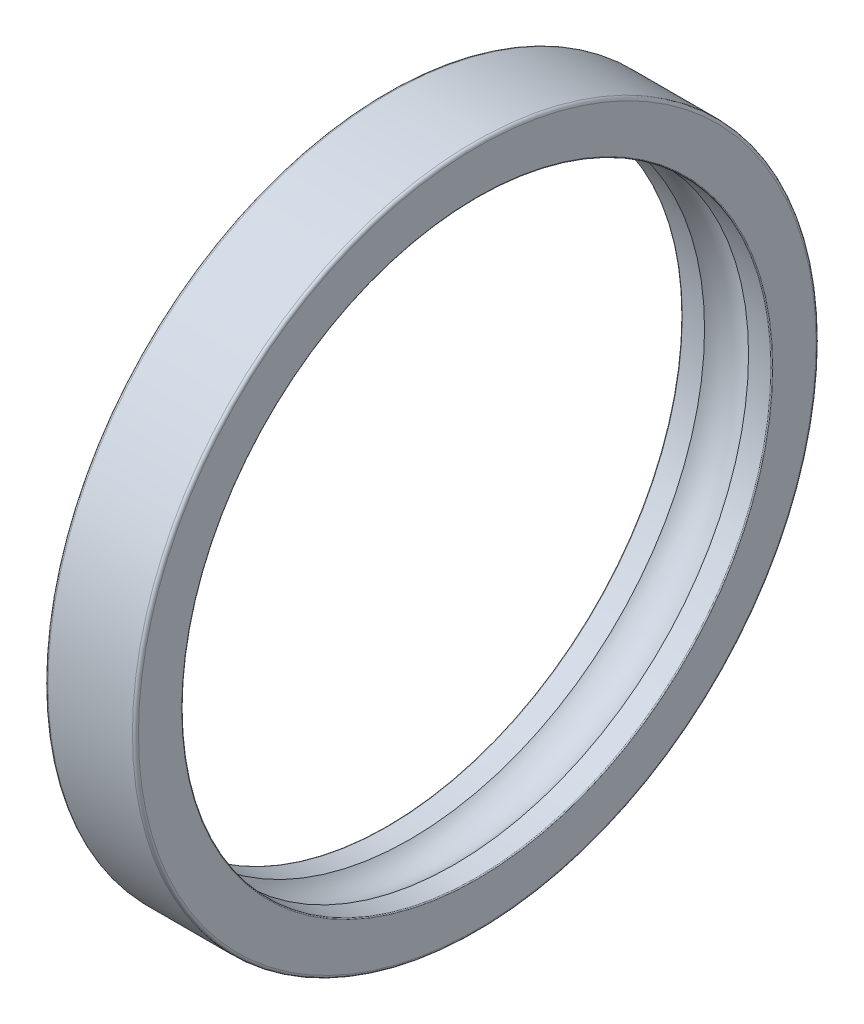
ISO-10303-21;
HEADER;
FILE_DESCRIPTION(('STEP AP214'),'2;1');
FILE_NAME('part.step','',(''),(''),'','','');
FILE_SCHEMA(('AUTOMOTIVE_DESIGN { 1 0 10303 214 1 1 1 1 }'));
ENDSEC;
DATA;
#1=APPLICATION_CONTEXT('core data for automotive mechanical design processes');
#2=APPLICATION_PROTOCOL_DEFINITION('international standard','automotive_design',2000,#1);
#3=PRODUCT_CONTEXT('',#1,'mechanical');
#4=PRODUCT('Part','Part','',(#3));
#5=PRODUCT_RELATED_PRODUCT_CATEGORY('part','',(#4));
#6=PRODUCT_DEFINITION_FORMATION('','',#4);
#7=PRODUCT_DEFINITION_CONTEXT('part definition',#1,'design');
#8=PRODUCT_DEFINITION('design','',#6,#7);
#9=PRODUCT_DEFINITION_SHAPE('','',#8);
#10=(LENGTH_UNIT() NAMED_UNIT(*) SI_UNIT(.MILLI.,.METRE.));
#11=(NAMED_UNIT(*) PLANE_ANGLE_UNIT() SI_UNIT($,.RADIAN.));
#12=(NAMED_UNIT(*) SI_UNIT($,.STERADIAN.) SOLID_ANGLE_UNIT());
#13=UNCERTAINTY_MEASURE_WITH_UNIT(LENGTH_MEASURE(1.E-05),#10,'distance_accuracy_value','');
#14=(GEOMETRIC_REPRESENTATION_CONTEXT(3) GLOBAL_UNCERTAINTY_ASSIGNED_CONTEXT((#13)) GLOBAL_UNIT_ASSIGNED_CONTEXT((#10,
#11,#12)) REPRESENTATION_CONTEXT('',''));
#15=CARTESIAN_POINT('',(0.,0.,0.));
#16=DIRECTION('',(0.,0.,1.));
#17=DIRECTION('',(1.,0.,0.));
#18=AXIS2_PLACEMENT_3D('',#15,#16,#17);
#19=CARTESIAN_POINT('',(0.,-34.0734108237942,-33.7));
#20=DIRECTION('',(-1.,0.,0.));
#21=DIRECTION('',(0.,0.,1.));
#22=AXIS2_PLACEMENT_3D('',#19,#20,#21);
#23=PLANE('',#22);
#24=CARTESIAN_POINT('',(0.,0.,0.));
#25=DIRECTION('',(-1.,0.,0.));
#26=DIRECTION('',(0.,0.,-1.));
#27=AXIS2_PLACEMENT_3D('',#24,#25,#26);
#28=CIRCLE('',#27,33.7);
#29=CARTESIAN_POINT('',(0.,0.,-33.7));
#30=VERTEX_POINT('',#29);
#31=EDGE_CURVE('E49',#30,#30,#28,.F.);
#32=ORIENTED_EDGE('',*,*,#31,.F.);
#33=EDGE_LOOP('',(#32));
#34=FACE_BOUND('',#33,.T.);
#35=CARTESIAN_POINT('',(0.,0.,0.));
#36=DIRECTION('',(1.,0.,0.));
#37=DIRECTION('',(0.,-1.16855785818745E-09,1.));
#38=AXIS2_PLACEMENT_3D('',#35,#36,#37);
#39=CIRCLE('',#38,29.3999999999994);
#40=CARTESIAN_POINT('',(0.,-3.43556010307105E-08,29.3999999999994));
#41=VERTEX_POINT('',#40);
#42=EDGE_CURVE('E46',#41,#41,#39,.T.);
#43=ORIENTED_EDGE('',*,*,#42,.T.);
#44=EDGE_LOOP('',(#43));
#45=FACE_BOUND('',#44,.T.);
#46=ADVANCED_FACE('F14',(#34,#45),#23,.T.);
#47=CARTESIAN_POINT('',(9.,-34.0734107695496,33.7));
#48=DIRECTION('',(1.,0.,0.));
#49=DIRECTION('',(0.,0.,-1.));
#50=AXIS2_PLACEMENT_3D('',#47,#48,#49);
#51=PLANE('',#50);
#52=CARTESIAN_POINT('',(9.,0.,0.));
#53=DIRECTION('',(1.,0.,0.));
#54=DIRECTION('',(0.,-1.16862858328693E-09,1.));
#55=AXIS2_PLACEMENT_3D('',#52,#53,#54);
#56=CIRCLE('',#55,33.7);
#57=CARTESIAN_POINT('',(9.,-3.93827832567695E-08,33.7));
#58=VERTEX_POINT('',#57);
#59=EDGE_CURVE('E43',#58,#58,#56,.T.);
#60=ORIENTED_EDGE('',*,*,#59,.T.);
#61=EDGE_LOOP('',(#60));
#62=FACE_BOUND('',#61,.T.);
#63=CARTESIAN_POINT('',(9.,0.,0.));
#64=DIRECTION('',(-1.,0.,0.));
#65=DIRECTION('',(0.,0.,-1.));
#66=AXIS2_PLACEMENT_3D('',#63,#64,#65);
#67=CIRCLE('',#66,29.4000000258519);
#68=CARTESIAN_POINT('',(9.,0.,-29.4000000258519));
#69=VERTEX_POINT('',#68);
#70=EDGE_CURVE('E40',#69,#69,#67,.F.);
#71=ORIENTED_EDGE('',*,*,#70,.F.);
#72=EDGE_LOOP('',(#71));
#73=FACE_BOUND('',#72,.T.);
#74=ADVANCED_FACE('F58',(#62,#73),#51,.T.);
#75=CARTESIAN_POINT('',(0.299999999999937,0.,0.));
#76=DIRECTION('',(1.,0.,0.));
#77=DIRECTION('',(0.,1.92344929213359E-10,1.));
#78=AXIS2_PLACEMENT_3D('',#75,#76,#77);
#79=TOROIDAL_SURFACE('',#78,33.7,0.299999999999932);
#80=ORIENTED_EDGE('',*,*,#31,.T.);
#81=EDGE_LOOP('',(#80));
#82=FACE_BOUND('',#81,.T.);
#83=CARTESIAN_POINT('',(0.299999999999937,0.,0.));
#84=DIRECTION('',(-1.,0.,0.));
#85=DIRECTION('',(0.,0.,-1.));
#86=AXIS2_PLACEMENT_3D('',#83,#84,#85);
#87=CIRCLE('',#86,33.9999999999999);
#88=CARTESIAN_POINT('',(0.299999999999937,0.,-33.9999999999999));
#89=VERTEX_POINT('',#88);
#90=EDGE_CURVE('E37',#89,#89,#87,.F.);
#91=ORIENTED_EDGE('',*,*,#90,.F.);
#92=EDGE_LOOP('',(#91));
#93=FACE_BOUND('',#92,.T.);
#94=ADVANCED_FACE('F53',(#82,#93),#79,.T.);
#95=CARTESIAN_POINT('',(0.0999999999994098,0.,0.));
#96=DIRECTION('',(1.,0.,0.));
#97=DIRECTION('',(0.,0.,1.));
#98=AXIS2_PLACEMENT_3D('',#95,#96,#97);
#99=TOROIDAL_SURFACE('',#98,29.3999999999994,0.0999999999994098);
#100=CARTESIAN_POINT('',(0.100000000000003,0.,0.));
#101=DIRECTION('',(1.,0.,0.));
#102=DIRECTION('',(0.,0.,1.));
#103=AXIS2_PLACEMENT_3D('',#100,#101,#102);
#104=CIRCLE('',#103,29.3);
#105=CARTESIAN_POINT('',(0.100000000000003,0.,29.3));
#106=VERTEX_POINT('',#105);
#107=EDGE_CURVE('E34',#106,#106,#104,.T.);
#108=ORIENTED_EDGE('',*,*,#107,.T.);
#109=EDGE_LOOP('',(#108));
#110=FACE_BOUND('',#109,.T.);
#111=ORIENTED_EDGE('',*,*,#42,.F.);
#112=EDGE_LOOP('',(#111));
#113=FACE_BOUND('',#112,.T.);
#114=ADVANCED_FACE('F62',(#110,#113),#99,.T.);
#115=CARTESIAN_POINT('',(50.,0.,0.));
#116=DIRECTION('',(1.,0.,0.));
#117=DIRECTION('',(0.,0.,1.));
#118=AXIS2_PLACEMENT_3D('',#115,#116,#117);
#119=CYLINDRICAL_SURFACE('',#118,29.3);
#120=CARTESIAN_POINT('',(2.31125035693889,0.,0.));
#121=DIRECTION('',(1.,0.,0.));
#122=DIRECTION('',(0.,-1.9234157565953E-10,1.));
#123=AXIS2_PLACEMENT_3D('',#120,#121,#122);
#124=CIRCLE('',#123,29.3);
#125=CARTESIAN_POINT('',(2.31125035693889,-5.63560816682423E-09,29.3));
#126=VERTEX_POINT('',#125);
#127=EDGE_CURVE('E29',#126,#126,#124,.T.);
#128=ORIENTED_EDGE('',*,*,#127,.T.);
#129=EDGE_LOOP('',(#128));
#130=FACE_BOUND('',#129,.T.);
#131=ORIENTED_EDGE('',*,*,#107,.F.);
#132=EDGE_LOOP('',(#131));
#133=FACE_BOUND('',#132,.T.);
#134=ADVANCED_FACE('F64',(#130,#133),#119,.F.);
#135=CARTESIAN_POINT('',(4.5,0.,0.));
#136=DIRECTION('',(1.,0.,0.));
#137=DIRECTION('',(0.,0.,1.));
#138=AXIS2_PLACEMENT_3D('',#135,#136,#137);
#139=TOROIDAL_SURFACE('',#138,27.,3.17500000000005);
#140=ORIENTED_EDGE('',*,*,#127,.F.);
#141=EDGE_LOOP('',(#140));
#142=FACE_BOUND('',#141,.T.);
#143=CARTESIAN_POINT('',(6.68874964306113,0.,0.));
#144=DIRECTION('',(1.,0.,0.));
#145=DIRECTION('',(0.,-1.92330917518494E-10,1.));
#146=AXIS2_PLACEMENT_3D('',#143,#144,#145);
#147=CIRCLE('',#146,29.3);
#148=CARTESIAN_POINT('',(6.68874964306113,-5.63529588329187E-09,29.3));
#149=VERTEX_POINT('',#148);
#150=EDGE_CURVE('E25',#149,#149,#147,.T.);
#151=ORIENTED_EDGE('',*,*,#150,.T.);
#152=EDGE_LOOP('',(#151));
#153=FACE_BOUND('',#152,.T.);
#154=ADVANCED_FACE('F72',(#142,#153),#139,.F.);
#155=CARTESIAN_POINT('',(50.,0.,0.));
#156=DIRECTION('',(1.,0.,0.));
#157=DIRECTION('',(0.,0.,1.));
#158=AXIS2_PLACEMENT_3D('',#155,#156,#157);
#159=CYLINDRICAL_SURFACE('',#158,29.3);
#160=CARTESIAN_POINT('',(8.9,0.,0.));
#161=DIRECTION('',(1.,0.,0.));
#162=DIRECTION('',(0.,-1.92330917518494E-10,1.));
#163=AXIS2_PLACEMENT_3D('',#160,#161,#162);
#164=CIRCLE('',#163,29.3);
#165=CARTESIAN_POINT('',(8.9,-5.63529588329186E-09,29.3));
#166=VERTEX_POINT('',#165);
#167=EDGE_CURVE('E21',#166,#166,#164,.T.);
#168=ORIENTED_EDGE('',*,*,#167,.T.);
#169=EDGE_LOOP('',(#168));
#170=FACE_BOUND('',#169,.T.);
#171=ORIENTED_EDGE('',*,*,#150,.F.);
#172=EDGE_LOOP('',(#171));
#173=FACE_BOUND('',#172,.T.);
#174=ADVANCED_FACE('F80',(#170,#173),#159,.F.);
#175=CARTESIAN_POINT('',(8.90000000000067,0.,0.));
#176=DIRECTION('',(1.,0.,0.));
#177=DIRECTION('',(0.,1.16855826160653E-09,1.));
#178=AXIS2_PLACEMENT_3D('',#175,#176,#177);
#179=TOROIDAL_SURFACE('',#178,29.3999999999994,0.0999999999993333);
#180=ORIENTED_EDGE('',*,*,#70,.T.);
#181=EDGE_LOOP('',(#180));
#182=FACE_BOUND('',#181,.T.);
#183=ORIENTED_EDGE('',*,*,#167,.F.);
#184=EDGE_LOOP('',(#183));
#185=FACE_BOUND('',#184,.T.);
#186=ADVANCED_FACE('F84',(#182,#185),#179,.T.);
#187=CARTESIAN_POINT('',(8.70000000000012,0.,0.));
#188=DIRECTION('',(1.,0.,0.));
#189=DIRECTION('',(0.,0.,1.));
#190=AXIS2_PLACEMENT_3D('',#187,#188,#189);
#191=TOROIDAL_SURFACE('',#190,33.7,0.299999999999878);
#192=CARTESIAN_POINT('',(8.70000000000012,0.,0.));
#193=DIRECTION('',(1.,0.,0.));
#194=DIRECTION('',(0.,0.,1.));
#195=AXIS2_PLACEMENT_3D('',#192,#193,#194);
#196=CIRCLE('',#195,33.9999999999999);
#197=CARTESIAN_POINT('',(8.70000000000012,0.,33.9999999999999));
#198=VERTEX_POINT('',#197);
#199=EDGE_CURVE('E10',#198,#198,#196,.T.);
#200=ORIENTED_EDGE('',*,*,#199,.T.);
#201=EDGE_LOOP('',(#200));
#202=FACE_BOUND('',#201,.T.);
#203=ORIENTED_EDGE('',*,*,#59,.F.);
#204=EDGE_LOOP('',(#203));
#205=FACE_BOUND('',#204,.T.);
#206=ADVANCED_FACE('F86',(#202,#205),#191,.T.);
#207=CARTESIAN_POINT('',(50.,0.,0.));
#208=DIRECTION('',(1.,0.,0.));
#209=DIRECTION('',(0.,1.92344929213359E-10,1.));
#210=AXIS2_PLACEMENT_3D('',#207,#208,#209);
#211=CYLINDRICAL_SURFACE('',#210,34.);
#212=ORIENTED_EDGE('',*,*,#90,.T.);
#213=EDGE_LOOP('',(#212));
#214=FACE_BOUND('',#213,.T.);
#215=ORIENTED_EDGE('',*,*,#199,.F.);
#216=EDGE_LOOP('',(#215));
#217=FACE_BOUND('',#216,.T.);
#218=ADVANCED_FACE('F16',(#214,#217),#211,.T.);
#219=CLOSED_SHELL('',(#46,#74,#94,#114,#134,#154,#174,#186,#206,#218));
#220=MANIFOLD_SOLID_BREP('B1',#219);
#221=ADVANCED_BREP_SHAPE_REPRESENTATION('',(#18,#220),#14);
#222=SHAPE_DEFINITION_REPRESENTATION(#9,#221);
ENDSEC;
END-ISO-10303-21;
